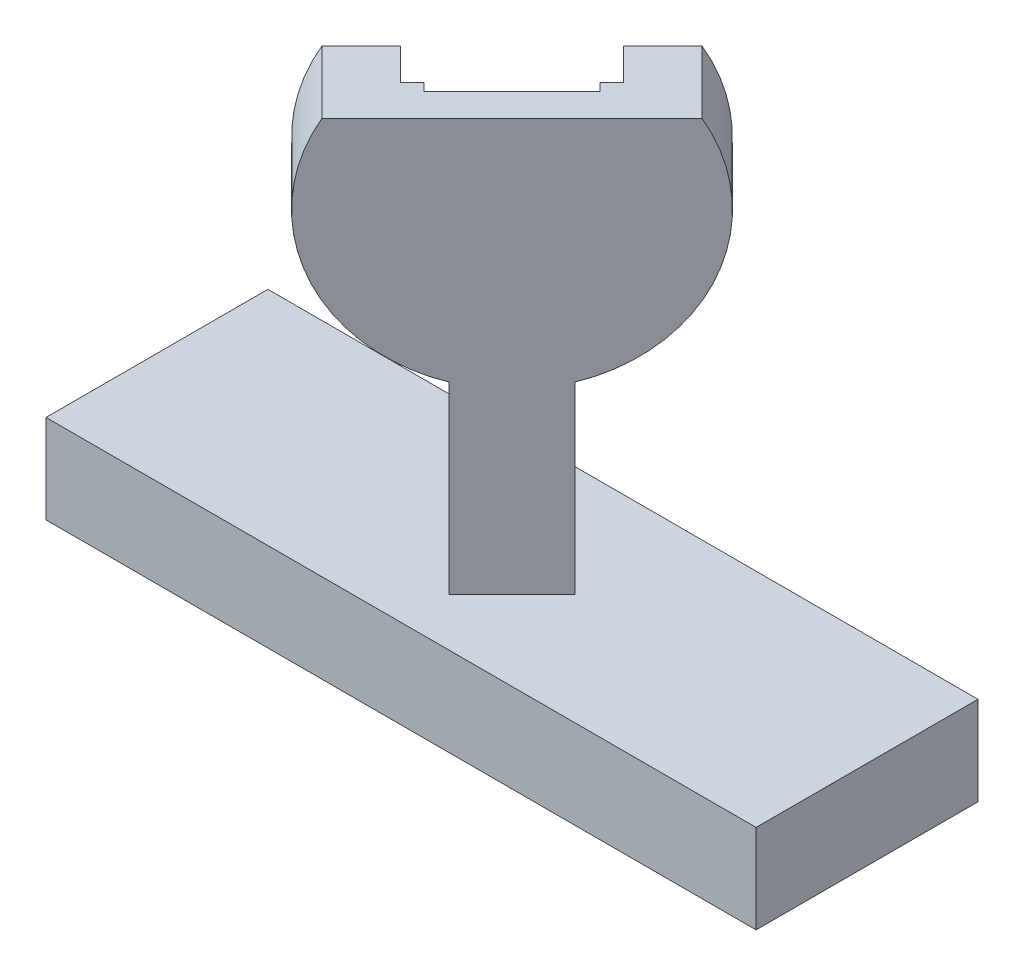
ISO-10303-21;
HEADER;
FILE_DESCRIPTION(('STEP AP214'),'2;1');
FILE_NAME('part.step','',(''),(''),'','','');
FILE_SCHEMA(('AUTOMOTIVE_DESIGN { 1 0 10303 214 1 1 1 1 }'));
ENDSEC;
DATA;
#1=APPLICATION_CONTEXT('core data for automotive mechanical design processes');
#2=APPLICATION_PROTOCOL_DEFINITION('international standard','automotive_design',2000,#1);
#3=PRODUCT_CONTEXT('',#1,'mechanical');
#4=PRODUCT('Part','Part','',(#3));
#5=PRODUCT_RELATED_PRODUCT_CATEGORY('part','',(#4));
#6=PRODUCT_DEFINITION_FORMATION('','',#4);
#7=PRODUCT_DEFINITION_CONTEXT('part definition',#1,'design');
#8=PRODUCT_DEFINITION('design','',#6,#7);
#9=PRODUCT_DEFINITION_SHAPE('','',#8);
#10=(LENGTH_UNIT() NAMED_UNIT(*) SI_UNIT(.MILLI.,.METRE.));
#11=(NAMED_UNIT(*) PLANE_ANGLE_UNIT() SI_UNIT($,.RADIAN.));
#12=(NAMED_UNIT(*) SI_UNIT($,.STERADIAN.) SOLID_ANGLE_UNIT());
#13=UNCERTAINTY_MEASURE_WITH_UNIT(LENGTH_MEASURE(1.E-05),#10,'distance_accuracy_value','');
#14=(GEOMETRIC_REPRESENTATION_CONTEXT(3) GLOBAL_UNCERTAINTY_ASSIGNED_CONTEXT((#13)) GLOBAL_UNIT_ASSIGNED_CONTEXT((#10,
#11,#12)) REPRESENTATION_CONTEXT('',''));
#15=CARTESIAN_POINT('',(0.,0.,0.));
#16=DIRECTION('',(0.,0.,1.));
#17=DIRECTION('',(1.,0.,0.));
#18=AXIS2_PLACEMENT_3D('',#15,#16,#17);
#19=CARTESIAN_POINT('',(0.,0.,0.));
#20=DIRECTION('',(0.,1.,0.));
#21=DIRECTION('',(0.,0.,1.));
#22=AXIS2_PLACEMENT_3D('',#19,#20,#21);
#23=PLANE('',#22);
#24=DIRECTION('',(0.,0.,1.));
#25=VECTOR('',#24,1.);
#26=CARTESIAN_POINT('',(40.64,0.,0.));
#27=LINE('',#26,#25);
#28=CARTESIAN_POINT('',(40.64,0.,-12.7));
#29=VERTEX_POINT('',#28);
#30=CARTESIAN_POINT('',(40.64,0.,12.7));
#31=VERTEX_POINT('',#30);
#32=EDGE_CURVE('E244',#29,#31,#27,.T.);
#33=ORIENTED_EDGE('',*,*,#32,.F.);
#34=DIRECTION('',(1.,0.,0.));
#35=VECTOR('',#34,1.);
#36=CARTESIAN_POINT('',(0.,0.,-12.7));
#37=LINE('',#36,#35);
#38=CARTESIAN_POINT('',(-40.64,0.,-12.7));
#39=VERTEX_POINT('',#38);
#40=EDGE_CURVE('E259',#39,#29,#37,.T.);
#41=ORIENTED_EDGE('',*,*,#40,.F.);
#42=DIRECTION('',(0.,0.,1.));
#43=VECTOR('',#42,1.);
#44=CARTESIAN_POINT('',(-40.64,0.,0.));
#45=LINE('',#44,#43);
#46=CARTESIAN_POINT('',(-40.64,0.,12.7));
#47=VERTEX_POINT('',#46);
#48=EDGE_CURVE('E261',#39,#47,#45,.T.);
#49=ORIENTED_EDGE('',*,*,#48,.T.);
#50=DIRECTION('',(1.,0.,0.));
#51=VECTOR('',#50,1.);
#52=CARTESIAN_POINT('',(0.,0.,12.7));
#53=LINE('',#52,#51);
#54=EDGE_CURVE('E248',#47,#31,#53,.T.);
#55=ORIENTED_EDGE('',*,*,#54,.T.);
#56=EDGE_LOOP('',(#33,#41,#49,#55));
#57=FACE_BOUND('',#56,.T.);
#58=DIRECTION('',(-0.707106781186548,0.,-0.707106781186547));
#59=VECTOR('',#58,1.);
#60=CARTESIAN_POINT('',(3.59210244842766,0.,-3.59210244842766));
#61=LINE('',#60,#59);
#62=CARTESIAN_POINT('',(7.18420489685532,0.,0.));
#63=VERTEX_POINT('',#62);
#64=CARTESIAN_POINT('',(0.,0.,-7.18420489685533));
#65=VERTEX_POINT('',#64);
#66=EDGE_CURVE('E227',#63,#65,#61,.T.);
#67=ORIENTED_EDGE('',*,*,#66,.F.);
#68=DIRECTION('',(0.707106781186547,0.,-0.707106781186548));
#69=VECTOR('',#68,1.);
#70=CARTESIAN_POINT('',(3.59210244842766,0.,3.59210244842766));
#71=LINE('',#70,#69);
#72=CARTESIAN_POINT('',(0.,0.,7.18420489685532));
#73=VERTEX_POINT('',#72);
#74=EDGE_CURVE('E224',#73,#63,#71,.T.);
#75=ORIENTED_EDGE('',*,*,#74,.F.);
#76=DIRECTION('',(0.707106781186548,0.,0.707106781186547));
#77=VECTOR('',#76,1.);
#78=CARTESIAN_POINT('',(-3.59210244842766,0.,3.59210244842766));
#79=LINE('',#78,#77);
#80=CARTESIAN_POINT('',(-7.18420489685532,0.,0.));
#81=VERTEX_POINT('',#80);
#82=EDGE_CURVE('E233',#81,#73,#79,.T.);
#83=ORIENTED_EDGE('',*,*,#82,.F.);
#84=DIRECTION('',(-0.707106781186547,0.,0.707106781186548));
#85=VECTOR('',#84,1.);
#86=CARTESIAN_POINT('',(-3.59210244842766,0.,-3.59210244842766));
#87=LINE('',#86,#85);
#88=EDGE_CURVE('E230',#65,#81,#87,.T.);
#89=ORIENTED_EDGE('',*,*,#88,.F.);
#90=EDGE_LOOP('',(#67,#75,#83,#89));
#91=FACE_BOUND('',#90,.T.);
#92=ADVANCED_FACE('F53',(#57,#91),#23,.T.);
#93=CARTESIAN_POINT('',(40.64,-10.16,0.));
#94=DIRECTION('',(-1.,0.,0.));
#95=DIRECTION('',(0.,0.,1.));
#96=AXIS2_PLACEMENT_3D('',#93,#94,#95);
#97=PLANE('',#96);
#98=ORIENTED_EDGE('',*,*,#32,.T.);
#99=DIRECTION('',(0.,1.,0.));
#100=VECTOR('',#99,1.);
#101=CARTESIAN_POINT('',(40.64,-10.16,12.7));
#102=LINE('',#101,#100);
#103=CARTESIAN_POINT('',(40.64,-10.16,12.7));
#104=VERTEX_POINT('',#103);
#105=EDGE_CURVE('E266',#104,#31,#102,.T.);
#106=ORIENTED_EDGE('',*,*,#105,.F.);
#107=DIRECTION('',(0.,0.,1.));
#108=VECTOR('',#107,1.);
#109=CARTESIAN_POINT('',(40.64,-10.16,0.));
#110=LINE('',#109,#108);
#111=CARTESIAN_POINT('',(40.64,-10.16,-12.7));
#112=VERTEX_POINT('',#111);
#113=EDGE_CURVE('E245',#112,#104,#110,.T.);
#114=ORIENTED_EDGE('',*,*,#113,.F.);
#115=DIRECTION('',(0.,1.,0.));
#116=VECTOR('',#115,1.);
#117=CARTESIAN_POINT('',(40.64,-10.16,-12.7));
#118=LINE('',#117,#116);
#119=EDGE_CURVE('E256',#112,#29,#118,.T.);
#120=ORIENTED_EDGE('',*,*,#119,.T.);
#121=EDGE_LOOP('',(#98,#106,#114,#120));
#122=FACE_BOUND('',#121,.T.);
#123=ADVANCED_FACE('F55',(#122),#97,.F.);
#124=CARTESIAN_POINT('',(0.,-10.16,12.7));
#125=DIRECTION('',(0.,0.,1.));
#126=DIRECTION('',(1.,0.,0.));
#127=AXIS2_PLACEMENT_3D('',#124,#125,#126);
#128=PLANE('',#127);
#129=ORIENTED_EDGE('',*,*,#54,.F.);
#130=DIRECTION('',(0.,1.,0.));
#131=VECTOR('',#130,1.);
#132=CARTESIAN_POINT('',(-40.64,-10.16,12.7));
#133=LINE('',#132,#131);
#134=CARTESIAN_POINT('',(-40.64,-10.16,12.7));
#135=VERTEX_POINT('',#134);
#136=EDGE_CURVE('E268',#135,#47,#133,.T.);
#137=ORIENTED_EDGE('',*,*,#136,.F.);
#138=DIRECTION('',(1.,0.,0.));
#139=VECTOR('',#138,1.);
#140=CARTESIAN_POINT('',(0.,-10.16,12.7));
#141=LINE('',#140,#139);
#142=EDGE_CURVE('E253',#135,#104,#141,.T.);
#143=ORIENTED_EDGE('',*,*,#142,.T.);
#144=ORIENTED_EDGE('',*,*,#105,.T.);
#145=EDGE_LOOP('',(#129,#137,#143,#144));
#146=FACE_BOUND('',#145,.T.);
#147=ADVANCED_FACE('F315',(#146),#128,.T.);
#148=CARTESIAN_POINT('',(-40.64,-10.16,0.));
#149=DIRECTION('',(-1.,0.,0.));
#150=DIRECTION('',(0.,0.,1.));
#151=AXIS2_PLACEMENT_3D('',#148,#149,#150);
#152=PLANE('',#151);
#153=ORIENTED_EDGE('',*,*,#48,.F.);
#154=DIRECTION('',(0.,1.,0.));
#155=VECTOR('',#154,1.);
#156=CARTESIAN_POINT('',(-40.64,-10.16,-12.7));
#157=LINE('',#156,#155);
#158=CARTESIAN_POINT('',(-40.64,-10.16,-12.7));
#159=VERTEX_POINT('',#158);
#160=EDGE_CURVE('E270',#159,#39,#157,.T.);
#161=ORIENTED_EDGE('',*,*,#160,.F.);
#162=DIRECTION('',(0.,0.,1.));
#163=VECTOR('',#162,1.);
#164=CARTESIAN_POINT('',(-40.64,-10.16,0.));
#165=LINE('',#164,#163);
#166=EDGE_CURVE('E250',#159,#135,#165,.T.);
#167=ORIENTED_EDGE('',*,*,#166,.T.);
#168=ORIENTED_EDGE('',*,*,#136,.T.);
#169=EDGE_LOOP('',(#153,#161,#167,#168));
#170=FACE_BOUND('',#169,.T.);
#171=ADVANCED_FACE('F325',(#170),#152,.T.);
#172=CARTESIAN_POINT('',(0.,-10.16,-12.7));
#173=DIRECTION('',(0.,0.,1.));
#174=DIRECTION('',(1.,0.,0.));
#175=AXIS2_PLACEMENT_3D('',#172,#173,#174);
#176=PLANE('',#175);
#177=ORIENTED_EDGE('',*,*,#40,.T.);
#178=ORIENTED_EDGE('',*,*,#119,.F.);
#179=DIRECTION('',(1.,0.,0.));
#180=VECTOR('',#179,1.);
#181=CARTESIAN_POINT('',(0.,-10.16,-12.7));
#182=LINE('',#181,#180);
#183=EDGE_CURVE('E247',#159,#112,#182,.T.);
#184=ORIENTED_EDGE('',*,*,#183,.F.);
#185=ORIENTED_EDGE('',*,*,#160,.T.);
#186=EDGE_LOOP('',(#177,#178,#184,#185));
#187=FACE_BOUND('',#186,.T.);
#188=ADVANCED_FACE('F328',(#187),#176,.F.);
#189=CARTESIAN_POINT('',(0.,-10.16,0.));
#190=DIRECTION('',(0.,1.,0.));
#191=DIRECTION('',(0.,0.,1.));
#192=AXIS2_PLACEMENT_3D('',#189,#190,#191);
#193=PLANE('',#192);
#194=ORIENTED_EDGE('',*,*,#113,.T.);
#195=ORIENTED_EDGE('',*,*,#142,.F.);
#196=ORIENTED_EDGE('',*,*,#166,.F.);
#197=ORIENTED_EDGE('',*,*,#183,.T.);
#198=EDGE_LOOP('',(#194,#195,#196,#197));
#199=FACE_BOUND('',#198,.T.);
#200=ADVANCED_FACE('F321',(#199),#193,.F.);
#201=CARTESIAN_POINT('',(3.59210244842766,25.4,3.59210244842766));
#202=DIRECTION('',(-0.707106781186548,0.,-0.707106781186547));
#203=DIRECTION('',(-0.707106781186547,0.,0.707106781186548));
#204=AXIS2_PLACEMENT_3D('',#201,#202,#203);
#205=PLANE('',#204);
#206=DIRECTION('',(-0.707106781186547,0.,0.707106781186548));
#207=VECTOR('',#206,1.);
#208=CARTESIAN_POINT('',(3.59210244842766,47.1886574016745,3.59210244842766));
#209=LINE('',#208,#207);
#210=CARTESIAN_POINT('',(14.4764266379444,47.1886574016745,-7.29222174108912));
#211=VERTEX_POINT('',#210);
#212=CARTESIAN_POINT('',(-7.29222174108911,47.1886574016745,14.4764266379444));
#213=VERTEX_POINT('',#212);
#214=EDGE_CURVE('E195',#211,#213,#209,.T.);
#215=ORIENTED_EDGE('',*,*,#214,.T.);
#216=CARTESIAN_POINT('',(3.59210244842766,38.1635,3.59210244842766));
#217=DIRECTION('',(0.707106781186548,0.,0.707106781186547));
#218=DIRECTION('',(0.707106781186547,0.,-0.707106781186548));
#219=AXIS2_PLACEMENT_3D('',#216,#217,#218);
#220=CIRCLE('',#219,17.8435);
#221=CARTESIAN_POINT('',(0.,21.0584103407787,7.18420489685532));
#222=VERTEX_POINT('',#221);
#223=EDGE_CURVE('E199',#213,#222,#220,.T.);
#224=ORIENTED_EDGE('',*,*,#223,.T.);
#225=DIRECTION('',(0.,-1.,0.));
#226=VECTOR('',#225,1.);
#227=CARTESIAN_POINT('',(0.,25.4,7.18420489685532));
#228=LINE('',#227,#226);
#229=EDGE_CURVE('E236',#222,#73,#228,.T.);
#230=ORIENTED_EDGE('',*,*,#229,.T.);
#231=ORIENTED_EDGE('',*,*,#74,.T.);
#232=DIRECTION('',(0.,-1.,0.));
#233=VECTOR('',#232,1.);
#234=CARTESIAN_POINT('',(7.18420489685532,25.4,0.));
#235=LINE('',#234,#233);
#236=CARTESIAN_POINT('',(7.18420489685532,21.0584103407787,0.));
#237=VERTEX_POINT('',#236);
#238=EDGE_CURVE('E242',#237,#63,#235,.T.);
#239=ORIENTED_EDGE('',*,*,#238,.F.);
#240=EDGE_CURVE('E210',#237,#211,#220,.T.);
#241=ORIENTED_EDGE('',*,*,#240,.T.);
#242=EDGE_LOOP('',(#215,#224,#230,#231,#239,#241));
#243=FACE_BOUND('',#242,.T.);
#244=ADVANCED_FACE('F334',(#243),#205,.F.);
#245=CARTESIAN_POINT('',(3.59210244842766,25.4,-3.59210244842766));
#246=DIRECTION('',(-0.707106781186547,0.,0.707106781186548));
#247=DIRECTION('',(0.707106781186548,0.,0.707106781186547));
#248=AXIS2_PLACEMENT_3D('',#245,#246,#247);
#249=PLANE('',#248);
#250=DIRECTION('',(0.,-1.,0.));
#251=VECTOR('',#250,1.);
#252=CARTESIAN_POINT('',(0.,25.4,-7.18420489685533));
#253=LINE('',#252,#251);
#254=CARTESIAN_POINT('',(0.,21.0584103407787,-7.18420489685532));
#255=VERTEX_POINT('',#254);
#256=EDGE_CURVE('E240',#255,#65,#253,.T.);
#257=ORIENTED_EDGE('',*,*,#256,.F.);
#258=DIRECTION('',(0.707106781186548,0.,0.707106781186547));
#259=VECTOR('',#258,1.);
#260=CARTESIAN_POINT('',(0.,21.0584103407787,-7.18420489685532));
#261=LINE('',#260,#259);
#262=EDGE_CURVE('E215',#255,#237,#261,.T.);
#263=ORIENTED_EDGE('',*,*,#262,.T.);
#264=ORIENTED_EDGE('',*,*,#238,.T.);
#265=ORIENTED_EDGE('',*,*,#66,.T.);
#266=EDGE_LOOP('',(#257,#263,#264,#265));
#267=FACE_BOUND('',#266,.T.);
#268=ADVANCED_FACE('F347',(#267),#249,.F.);
#269=CARTESIAN_POINT('',(-3.59210244842766,25.4,-3.59210244842766));
#270=DIRECTION('',(0.707106781186548,0.,0.707106781186547));
#271=DIRECTION('',(0.707106781186547,0.,-0.707106781186548));
#272=AXIS2_PLACEMENT_3D('',#269,#270,#271);
#273=PLANE('',#272);
#274=CARTESIAN_POINT('',(-14.413311074316,38.1635,7.22910617746068));
#275=DIRECTION('',(-0.707106781186548,0.,-0.707106781186547));
#276=DIRECTION('',(-0.707106781186547,0.,0.707106781186548));
#277=AXIS2_PLACEMENT_3D('',#274,#275,#276);
#278=CIRCLE('',#277,1.72719999999999);
#279=CARTESIAN_POINT('',(-15.6346259067814,38.1635,8.45042100992607));
#280=VERTEX_POINT('',#279);
#281=EDGE_CURVE('E168',#280,#280,#278,.T.);
#282=ORIENTED_EDGE('',*,*,#281,.F.);
#283=EDGE_LOOP('',(#282));
#284=FACE_BOUND('',#283,.T.);
#285=CARTESIAN_POINT('',(7.22910617746066,38.1635,-14.413311074316));
#286=DIRECTION('',(-0.707106781186548,0.,-0.707106781186547));
#287=DIRECTION('',(-0.707106781186547,0.,0.707106781186548));
#288=AXIS2_PLACEMENT_3D('',#285,#286,#287);
#289=CIRCLE('',#288,1.72719999999999);
#290=CARTESIAN_POINT('',(6.00779134499526,38.1635,-13.1919962418506));
#291=VERTEX_POINT('',#290);
#292=EDGE_CURVE('E167',#291,#291,#289,.T.);
#293=ORIENTED_EDGE('',*,*,#292,.F.);
#294=EDGE_LOOP('',(#293));
#295=FACE_BOUND('',#294,.T.);
#296=CARTESIAN_POINT('',(-3.59210244842766,38.1635,-3.59210244842766));
#297=DIRECTION('',(0.707106781186548,0.,0.707106781186547));
#298=DIRECTION('',(0.707106781186547,0.,-0.707106781186548));
#299=AXIS2_PLACEMENT_3D('',#296,#297,#298);
#300=CIRCLE('',#299,17.8435);
#301=CARTESIAN_POINT('',(7.2922217410891,47.1886574016745,-14.4764266379444));
#302=VERTEX_POINT('',#301);
#303=EDGE_CURVE('E202',#255,#302,#300,.T.);
#304=ORIENTED_EDGE('',*,*,#303,.F.);
#305=ORIENTED_EDGE('',*,*,#256,.T.);
#306=ORIENTED_EDGE('',*,*,#88,.T.);
#307=DIRECTION('',(0.,-1.,0.));
#308=VECTOR('',#307,1.);
#309=CARTESIAN_POINT('',(-7.18420489685532,25.4,0.));
#310=LINE('',#309,#308);
#311=CARTESIAN_POINT('',(-7.18420489685532,21.0584103407787,0.));
#312=VERTEX_POINT('',#311);
#313=EDGE_CURVE('E238',#312,#81,#310,.T.);
#314=ORIENTED_EDGE('',*,*,#313,.F.);
#315=CARTESIAN_POINT('',(-14.4764266379444,47.1886574016745,7.29222174108912));
#316=VERTEX_POINT('',#315);
#317=EDGE_CURVE('E203',#316,#312,#300,.T.);
#318=ORIENTED_EDGE('',*,*,#317,.F.);
#319=DIRECTION('',(-0.707106781186547,0.,0.707106781186548));
#320=VECTOR('',#319,1.);
#321=CARTESIAN_POINT('',(-3.59210244842767,47.1886574016745,-3.59210244842766));
#322=LINE('',#321,#320);
#323=CARTESIAN_POINT('',(-9.97385244842766,47.1886574016745,2.78964755157233));
#324=VERTEX_POINT('',#323);
#325=EDGE_CURVE('E198',#324,#316,#322,.T.);
#326=ORIENTED_EDGE('',*,*,#325,.F.);
#327=CARTESIAN_POINT('',(-3.59210244842766,38.1635,-3.59210244842766));
#328=DIRECTION('',(0.707106781186548,0.,0.707106781186547));
#329=DIRECTION('',(0.707106781186547,0.,-0.707106781186548));
#330=AXIS2_PLACEMENT_3D('',#327,#328,#329);
#331=CIRCLE('',#330,12.7635);
#332=CARTESIAN_POINT('',(2.78964755157233,47.1886574016745,-9.97385244842765));
#333=VERTEX_POINT('',#332);
#334=EDGE_CURVE('E196',#324,#333,#331,.T.);
#335=ORIENTED_EDGE('',*,*,#334,.T.);
#336=DIRECTION('',(0.707106781186547,0.,-0.707106781186548));
#337=VECTOR('',#336,1.);
#338=CARTESIAN_POINT('',(-3.59210244842766,47.1886574016745,-3.59210244842767));
#339=LINE('',#338,#337);
#340=EDGE_CURVE('E206',#333,#302,#339,.T.);
#341=ORIENTED_EDGE('',*,*,#340,.T.);
#342=EDGE_LOOP('',(#304,#305,#306,#314,#318,#326,#335,#341));
#343=FACE_BOUND('',#342,.T.);
#344=ADVANCED_FACE('F282',(#284,#295,#343),#273,.F.);
#345=CARTESIAN_POINT('',(-3.59210244842766,25.4,3.59210244842766));
#346=DIRECTION('',(0.707106781186547,0.,-0.707106781186548));
#347=DIRECTION('',(-0.707106781186548,0.,-0.707106781186547));
#348=AXIS2_PLACEMENT_3D('',#345,#346,#347);
#349=PLANE('',#348);
#350=ORIENTED_EDGE('',*,*,#229,.F.);
#351=DIRECTION('',(0.707106781186548,0.,0.707106781186547));
#352=VECTOR('',#351,1.);
#353=CARTESIAN_POINT('',(-7.18420489685532,21.0584103407787,0.));
#354=LINE('',#353,#352);
#355=EDGE_CURVE('E61',#222,#312,#354,.F.);
#356=ORIENTED_EDGE('',*,*,#355,.T.);
#357=ORIENTED_EDGE('',*,*,#313,.T.);
#358=ORIENTED_EDGE('',*,*,#82,.T.);
#359=EDGE_LOOP('',(#350,#356,#357,#358));
#360=FACE_BOUND('',#359,.T.);
#361=ADVANCED_FACE('F276',(#360),#349,.F.);
#362=CARTESIAN_POINT('',(-3.59210244842766,38.1635,-3.59210244842766));
#363=DIRECTION('',(0.707106781186548,0.,0.707106781186547));
#364=DIRECTION('',(0.707106781186547,0.,-0.707106781186548));
#365=AXIS2_PLACEMENT_3D('',#362,#363,#364);
#366=CYLINDRICAL_SURFACE('',#365,17.8435);
#367=ORIENTED_EDGE('',*,*,#262,.F.);
#368=ORIENTED_EDGE('',*,*,#303,.T.);
#369=DIRECTION('',(0.707106781186548,0.,0.707106781186547));
#370=VECTOR('',#369,1.);
#371=CARTESIAN_POINT('',(7.2922217410891,47.1886574016745,-14.4764266379444));
#372=LINE('',#371,#370);
#373=EDGE_CURVE('E216',#302,#211,#372,.T.);
#374=ORIENTED_EDGE('',*,*,#373,.T.);
#375=ORIENTED_EDGE('',*,*,#240,.F.);
#376=EDGE_LOOP('',(#367,#368,#374,#375));
#377=FACE_BOUND('',#376,.T.);
#378=ADVANCED_FACE('F304',(#377),#366,.T.);
#379=ORIENTED_EDGE('',*,*,#355,.F.);
#380=ORIENTED_EDGE('',*,*,#223,.F.);
#381=DIRECTION('',(0.707106781186548,0.,0.707106781186547));
#382=VECTOR('',#381,1.);
#383=CARTESIAN_POINT('',(-14.4764266379444,47.1886574016745,7.29222174108912));
#384=LINE('',#383,#382);
#385=EDGE_CURVE('E219',#316,#213,#384,.T.);
#386=ORIENTED_EDGE('',*,*,#385,.F.);
#387=ORIENTED_EDGE('',*,*,#317,.T.);
#388=EDGE_LOOP('',(#379,#380,#386,#387));
#389=FACE_BOUND('',#388,.T.);
#390=ADVANCED_FACE('F286',(#389),#366,.T.);
#391=CARTESIAN_POINT('',(-3.59210244842766,38.1635,-3.59210244842766));
#392=DIRECTION('',(0.707106781186548,0.,0.707106781186547));
#393=DIRECTION('',(0.707106781186547,0.,-0.707106781186548));
#394=AXIS2_PLACEMENT_3D('',#391,#392,#393);
#395=CYLINDRICAL_SURFACE('',#394,12.7635);
#396=DIRECTION('',(0.707106781186548,0.,0.707106781186547));
#397=VECTOR('',#396,1.);
#398=CARTESIAN_POINT('',(-9.97385244842766,47.1886574016745,2.78964755157233));
#399=LINE('',#398,#397);
#400=CARTESIAN_POINT('',(-6.38174999996257,47.1886574016745,6.38175000003742));
#401=VERTEX_POINT('',#400);
#402=EDGE_CURVE('E68',#324,#401,#399,.T.);
#403=ORIENTED_EDGE('',*,*,#402,.T.);
#404=CARTESIAN_POINT('',(3.74205874620337E-11,38.1635,3.74240569089856E-11));
#405=DIRECTION('',(-0.707106781186548,0.,-0.707106781186547));
#406=DIRECTION('',(-0.707106781186547,0.,0.707106781186548));
#407=AXIS2_PLACEMENT_3D('',#404,#405,#406);
#408=CIRCLE('',#407,12.7635);
#409=CARTESIAN_POINT('',(6.38175000003741,47.1886574016745,-6.38174999996257));
#410=VERTEX_POINT('',#409);
#411=EDGE_CURVE('E72',#410,#401,#408,.T.);
#412=ORIENTED_EDGE('',*,*,#411,.F.);
#413=DIRECTION('',(0.707106781186548,0.,0.707106781186547));
#414=VECTOR('',#413,1.);
#415=CARTESIAN_POINT('',(2.78964755157233,47.1886574016745,-9.97385244842765));
#416=LINE('',#415,#414);
#417=EDGE_CURVE('E213',#333,#410,#416,.T.);
#418=ORIENTED_EDGE('',*,*,#417,.F.);
#419=ORIENTED_EDGE('',*,*,#334,.F.);
#420=EDGE_LOOP('',(#403,#412,#418,#419));
#421=FACE_BOUND('',#420,.T.);
#422=ADVANCED_FACE('F294',(#421),#395,.F.);
#423=CARTESIAN_POINT('',(-3.59210244842766,47.1886574016745,-3.59210244842767));
#424=DIRECTION('',(0.,-1.,0.));
#425=DIRECTION('',(0.,0.,-1.));
#426=AXIS2_PLACEMENT_3D('',#423,#424,#425);
#427=PLANE('',#426);
#428=ORIENTED_EDGE('',*,*,#385,.T.);
#429=ORIENTED_EDGE('',*,*,#214,.F.);
#430=ORIENTED_EDGE('',*,*,#373,.F.);
#431=ORIENTED_EDGE('',*,*,#340,.F.);
#432=ORIENTED_EDGE('',*,*,#417,.T.);
#433=DIRECTION('',(0.707106781186547,0.,-0.707106781186548));
#434=VECTOR('',#433,1.);
#435=CARTESIAN_POINT('',(0.,47.1886574016745,0.));
#436=LINE('',#435,#434);
#437=CARTESIAN_POINT('',(5.0322498012817,47.1886574016745,-5.03224980128171));
#438=VERTEX_POINT('',#437);
#439=EDGE_CURVE('E184',#438,#410,#436,.T.);
#440=ORIENTED_EDGE('',*,*,#439,.F.);
#441=DIRECTION('',(0.707106781186548,0.,0.707106781186547));
#442=VECTOR('',#441,1.);
#443=CARTESIAN_POINT('',(5.0322498012817,47.1886574016745,-5.03224980128171));
#444=LINE('',#443,#442);
#445=CARTESIAN_POINT('',(5.93027541338862,47.1886574016745,-4.1342241891748));
#446=VERTEX_POINT('',#445);
#447=EDGE_CURVE('E188',#438,#446,#444,.T.);
#448=ORIENTED_EDGE('',*,*,#447,.T.);
#449=DIRECTION('',(0.707106781186547,0.,-0.707106781186548));
#450=VECTOR('',#449,1.);
#451=CARTESIAN_POINT('',(0.898025612106918,47.1886574016745,0.89802561210691));
#452=LINE('',#451,#450);
#453=CARTESIAN_POINT('',(-4.13422418913737,47.1886574016745,5.93027541342605));
#454=VERTEX_POINT('',#453);
#455=EDGE_CURVE('E191',#454,#446,#452,.T.);
#456=ORIENTED_EDGE('',*,*,#455,.F.);
#457=DIRECTION('',(0.707106781186548,0.,0.707106781186547));
#458=VECTOR('',#457,1.);
#459=CARTESIAN_POINT('',(-5.03224980128171,47.1886574016745,5.03224980128171));
#460=LINE('',#459,#458);
#461=CARTESIAN_POINT('',(-5.03224980128171,47.1886574016745,5.03224980128171));
#462=VERTEX_POINT('',#461);
#463=EDGE_CURVE('E187',#462,#454,#460,.T.);
#464=ORIENTED_EDGE('',*,*,#463,.F.);
#465=DIRECTION('',(0.707106781186547,0.,-0.707106781186548));
#466=VECTOR('',#465,1.);
#467=CARTESIAN_POINT('',(0.,47.1886574016745,0.));
#468=LINE('',#467,#466);
#469=EDGE_CURVE('E181',#401,#462,#468,.T.);
#470=ORIENTED_EDGE('',*,*,#469,.F.);
#471=ORIENTED_EDGE('',*,*,#402,.F.);
#472=ORIENTED_EDGE('',*,*,#325,.T.);
#473=EDGE_LOOP('',(#428,#429,#430,#431,#432,#440,#448,#456,#464,#470,#471,#472));
#474=FACE_BOUND('',#473,.T.);
#475=ADVANCED_FACE('F288',(#474),#427,.F.);
#476=CARTESIAN_POINT('',(0.898025612144337,38.1635,0.89802561214434));
#477=DIRECTION('',(-0.707106781186548,0.,-0.707106781186547));
#478=DIRECTION('',(-0.707106781186547,0.,0.707106781186548));
#479=AXIS2_PLACEMENT_3D('',#476,#477,#478);
#480=PLANE('',#479);
#481=CARTESIAN_POINT('',(0.898025612144337,38.1635,0.89802561214434));
#482=DIRECTION('',(-0.707106781186548,0.,-0.707106781186547));
#483=DIRECTION('',(-0.707106781186547,0.,0.707106781186548));
#484=AXIS2_PLACEMENT_3D('',#481,#482,#483);
#485=CIRCLE('',#484,11.4935);
#486=EDGE_CURVE('E11',#454,#446,#485,.F.);
#487=ORIENTED_EDGE('',*,*,#486,.F.);
#488=ORIENTED_EDGE('',*,*,#455,.T.);
#489=EDGE_LOOP('',(#487,#488));
#490=FACE_BOUND('',#489,.T.);
#491=ADVANCED_FACE('F301',(#490),#480,.T.);
#492=CARTESIAN_POINT('',(3.74205874620337E-11,38.1635,3.74240569089856E-11));
#493=DIRECTION('',(0.707106781186548,0.,0.707106781186547));
#494=DIRECTION('',(0.707106781186547,0.,-0.707106781186548));
#495=AXIS2_PLACEMENT_3D('',#492,#493,#494);
#496=CYLINDRICAL_SURFACE('',#495,11.4935);
#497=ORIENTED_EDGE('',*,*,#463,.T.);
#498=ORIENTED_EDGE('',*,*,#486,.T.);
#499=ORIENTED_EDGE('',*,*,#447,.F.);
#500=CARTESIAN_POINT('',(3.74205874620337E-11,38.1635,3.74240569089856E-11));
#501=DIRECTION('',(-0.707106781186548,0.,-0.707106781186547));
#502=DIRECTION('',(-0.707106781186547,0.,0.707106781186548));
#503=AXIS2_PLACEMENT_3D('',#500,#501,#502);
#504=CIRCLE('',#503,11.4935);
#505=EDGE_CURVE('E178',#438,#462,#504,.T.);
#506=ORIENTED_EDGE('',*,*,#505,.T.);
#507=EDGE_LOOP('',(#497,#498,#499,#506));
#508=FACE_BOUND('',#507,.T.);
#509=ADVANCED_FACE('F367',(#508),#496,.F.);
#510=CARTESIAN_POINT('',(3.74205874620337E-11,38.1635,3.74240569089856E-11));
#511=DIRECTION('',(-0.707106781186548,0.,-0.707106781186547));
#512=DIRECTION('',(-0.707106781186547,0.,0.707106781186548));
#513=AXIS2_PLACEMENT_3D('',#510,#511,#512);
#514=PLANE('',#513);
#515=ORIENTED_EDGE('',*,*,#505,.F.);
#516=ORIENTED_EDGE('',*,*,#439,.T.);
#517=ORIENTED_EDGE('',*,*,#411,.T.);
#518=ORIENTED_EDGE('',*,*,#469,.T.);
#519=EDGE_LOOP('',(#515,#516,#517,#518));
#520=FACE_BOUND('',#519,.T.);
#521=ADVANCED_FACE('F371',(#520),#514,.T.);
#522=CARTESIAN_POINT('',(12.6172598501022,38.1635,-9.02515740167451));
#523=DIRECTION('',(-0.707106781186548,0.,-0.707106781186547));
#524=DIRECTION('',(-0.707106781186547,0.,0.707106781186548));
#525=AXIS2_PLACEMENT_3D('',#522,#523,#524);
#526=CONICAL_SURFACE('',#525,1.7272,1.02974425867665);
#527=CARTESIAN_POINT('',(13.3510998363649,38.1635,-8.29131741541181));
#528=VERTEX_POINT('',#527);
#529=VERTEX_LOOP('',#528);
#530=FACE_BOUND('',#529,.T.);
#531=CARTESIAN_POINT('',(12.6172598501022,38.1635,-9.02515740167451));
#532=DIRECTION('',(-0.707106781186548,0.,-0.707106781186547));
#533=DIRECTION('',(-0.707106781186547,0.,0.707106781186548));
#534=AXIS2_PLACEMENT_3D('',#531,#532,#533);
#535=CIRCLE('',#534,1.7272);
#536=CARTESIAN_POINT('',(11.3959450176368,38.1635,-7.80384256920911));
#537=VERTEX_POINT('',#536);
#538=EDGE_CURVE('E171',#537,#537,#535,.T.);
#539=ORIENTED_EDGE('',*,*,#538,.T.);
#540=EDGE_LOOP('',(#539));
#541=FACE_BOUND('',#540,.T.);
#542=ADVANCED_FACE('F375',(#530,#541),#526,.F.);
#543=CARTESIAN_POINT('',(7.22910617746066,38.1635,-14.413311074316));
#544=DIRECTION('',(-0.707106781186548,0.,-0.707106781186547));
#545=DIRECTION('',(-0.707106781186547,0.,0.707106781186548));
#546=AXIS2_PLACEMENT_3D('',#543,#544,#545);
#547=CYLINDRICAL_SURFACE('',#546,1.72719999999999);
#548=ORIENTED_EDGE('',*,*,#538,.F.);
#549=EDGE_LOOP('',(#548));
#550=FACE_BOUND('',#549,.T.);
#551=ORIENTED_EDGE('',*,*,#292,.T.);
#552=EDGE_LOOP('',(#551));
#553=FACE_BOUND('',#552,.T.);
#554=ADVANCED_FACE('F161',(#550,#553),#547,.F.);
#555=CARTESIAN_POINT('',(-9.0251574016745,38.1635,12.6172598501022));
#556=DIRECTION('',(-0.707106781186548,0.,-0.707106781186547));
#557=DIRECTION('',(-0.707106781186547,0.,0.707106781186548));
#558=AXIS2_PLACEMENT_3D('',#555,#556,#557);
#559=CONICAL_SURFACE('',#558,1.7272,1.02974425867665);
#560=CARTESIAN_POINT('',(-8.2913174154118,38.1635,13.3510998363649));
#561=VERTEX_POINT('',#560);
#562=VERTEX_LOOP('',#561);
#563=FACE_BOUND('',#562,.T.);
#564=CARTESIAN_POINT('',(-9.0251574016745,38.1635,12.6172598501022));
#565=DIRECTION('',(-0.707106781186548,0.,-0.707106781186547));
#566=DIRECTION('',(-0.707106781186547,0.,0.707106781186548));
#567=AXIS2_PLACEMENT_3D('',#564,#565,#566);
#568=CIRCLE('',#567,1.7272);
#569=CARTESIAN_POINT('',(-10.2464722341399,38.1635,13.8385746825676));
#570=VERTEX_POINT('',#569);
#571=EDGE_CURVE('E165',#570,#570,#568,.T.);
#572=ORIENTED_EDGE('',*,*,#571,.T.);
#573=EDGE_LOOP('',(#572));
#574=FACE_BOUND('',#573,.T.);
#575=ADVANCED_FACE('F157',(#563,#574),#559,.F.);
#576=CARTESIAN_POINT('',(-14.413311074316,38.1635,7.22910617746068));
#577=DIRECTION('',(-0.707106781186548,0.,-0.707106781186547));
#578=DIRECTION('',(-0.707106781186547,0.,0.707106781186548));
#579=AXIS2_PLACEMENT_3D('',#576,#577,#578);
#580=CYLINDRICAL_SURFACE('',#579,1.72719999999999);
#581=ORIENTED_EDGE('',*,*,#571,.F.);
#582=EDGE_LOOP('',(#581));
#583=FACE_BOUND('',#582,.T.);
#584=ORIENTED_EDGE('',*,*,#281,.T.);
#585=EDGE_LOOP('',(#584));
#586=FACE_BOUND('',#585,.T.);
#587=ADVANCED_FACE('F160',(#583,#586),#580,.F.);
#588=CLOSED_SHELL('',(#92,#123,#147,#171,#188,#200,#244,#268,#344,#361,#378,#390,#422,#475,#491,
#509,#521,#542,#554,#575,#587));
#589=MANIFOLD_SOLID_BREP('B2',#588);
#590=ADVANCED_BREP_SHAPE_REPRESENTATION('',(#18,#589),#14);
#591=SHAPE_DEFINITION_REPRESENTATION(#9,#590);
ENDSEC;
END-ISO-10303-21;
